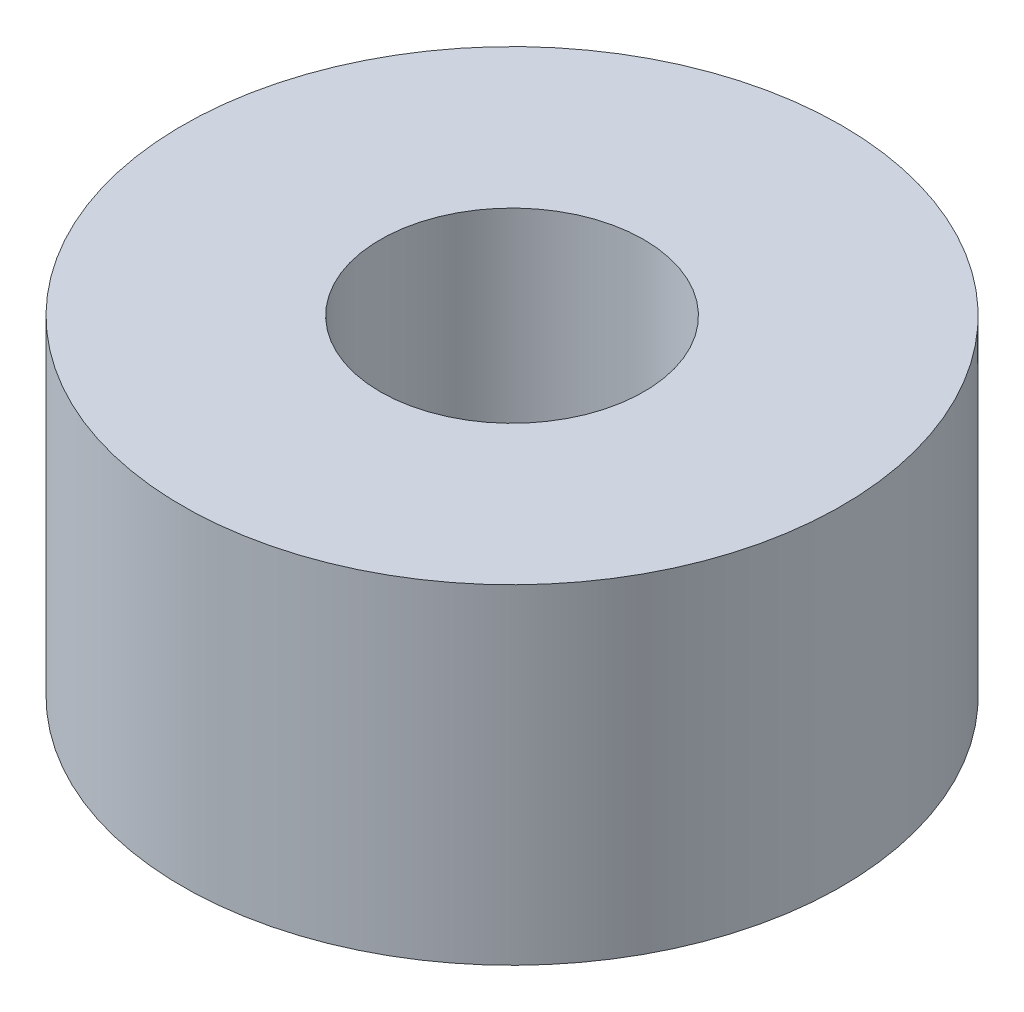
ISO-10303-21;
HEADER;
FILE_DESCRIPTION(('STEP AP214'),'2;1');
FILE_NAME('part.step','',(''),(''),'','','');
FILE_SCHEMA(('AUTOMOTIVE_DESIGN { 1 0 10303 214 1 1 1 1 }'));
ENDSEC;
DATA;
#1=APPLICATION_CONTEXT('core data for automotive mechanical design processes');
#2=APPLICATION_PROTOCOL_DEFINITION('international standard','automotive_design',2000,#1);
#3=PRODUCT_CONTEXT('',#1,'mechanical');
#4=PRODUCT('Part','Part','',(#3));
#5=PRODUCT_RELATED_PRODUCT_CATEGORY('part','',(#4));
#6=PRODUCT_DEFINITION_FORMATION('','',#4);
#7=PRODUCT_DEFINITION_CONTEXT('part definition',#1,'design');
#8=PRODUCT_DEFINITION('design','',#6,#7);
#9=PRODUCT_DEFINITION_SHAPE('','',#8);
#10=(LENGTH_UNIT() NAMED_UNIT(*) SI_UNIT(.MILLI.,.METRE.));
#11=(NAMED_UNIT(*) PLANE_ANGLE_UNIT() SI_UNIT($,.RADIAN.));
#12=(NAMED_UNIT(*) SI_UNIT($,.STERADIAN.) SOLID_ANGLE_UNIT());
#13=UNCERTAINTY_MEASURE_WITH_UNIT(LENGTH_MEASURE(1.E-05),#10,'distance_accuracy_value','');
#14=(GEOMETRIC_REPRESENTATION_CONTEXT(3) GLOBAL_UNCERTAINTY_ASSIGNED_CONTEXT((#13)) GLOBAL_UNIT_ASSIGNED_CONTEXT((#10,
#11,#12)) REPRESENTATION_CONTEXT('',''));
#15=CARTESIAN_POINT('',(0.,0.,0.));
#16=DIRECTION('',(0.,0.,1.));
#17=DIRECTION('',(1.,0.,0.));
#18=AXIS2_PLACEMENT_3D('',#15,#16,#17);
#19=CARTESIAN_POINT('',(0.,2.5,0.));
#20=DIRECTION('',(0.,-1.,0.));
#21=DIRECTION('',(0.,0.,-1.));
#22=AXIS2_PLACEMENT_3D('',#19,#20,#21);
#23=CYLINDRICAL_SURFACE('',#22,2.5);
#24=CARTESIAN_POINT('',(0.,2.5,0.));
#25=DIRECTION('',(0.,-1.,0.));
#26=DIRECTION('',(0.,0.,-1.));
#27=AXIS2_PLACEMENT_3D('',#24,#25,#26);
#28=CIRCLE('',#27,2.5);
#29=CARTESIAN_POINT('',(0.,2.5,-2.5));
#30=VERTEX_POINT('',#29);
#31=EDGE_CURVE('E10',#30,#30,#28,.T.);
#32=ORIENTED_EDGE('',*,*,#31,.T.);
#33=EDGE_LOOP('',(#32));
#34=FACE_BOUND('',#33,.T.);
#35=CARTESIAN_POINT('',(0.,0.,0.));
#36=DIRECTION('',(0.,-1.,0.));
#37=DIRECTION('',(0.,0.,-1.));
#38=AXIS2_PLACEMENT_3D('',#35,#36,#37);
#39=CIRCLE('',#38,2.5);
#40=CARTESIAN_POINT('',(0.,0.,-2.5));
#41=VERTEX_POINT('',#40);
#42=EDGE_CURVE('E47',#41,#41,#39,.T.);
#43=ORIENTED_EDGE('',*,*,#42,.F.);
#44=EDGE_LOOP('',(#43));
#45=FACE_BOUND('',#44,.T.);
#46=ADVANCED_FACE('F33',(#34,#45),#23,.T.);
#47=CARTESIAN_POINT('',(2.5,2.5,0.));
#48=DIRECTION('',(0.,1.,0.));
#49=DIRECTION('',(0.,0.,1.));
#50=AXIS2_PLACEMENT_3D('',#47,#48,#49);
#51=PLANE('',#50);
#52=CARTESIAN_POINT('',(0.,2.5,0.));
#53=DIRECTION('',(0.,-1.,0.));
#54=DIRECTION('',(0.,0.,-1.));
#55=AXIS2_PLACEMENT_3D('',#52,#53,#54);
#56=CIRCLE('',#55,1.);
#57=CARTESIAN_POINT('',(0.,2.5,-1.));
#58=VERTEX_POINT('',#57);
#59=EDGE_CURVE('E39',#58,#58,#56,.T.);
#60=ORIENTED_EDGE('',*,*,#59,.T.);
#61=EDGE_LOOP('',(#60));
#62=FACE_BOUND('',#61,.T.);
#63=ORIENTED_EDGE('',*,*,#31,.F.);
#64=EDGE_LOOP('',(#63));
#65=FACE_BOUND('',#64,.T.);
#66=ADVANCED_FACE('F57',(#62,#65),#51,.T.);
#67=CARTESIAN_POINT('',(0.,2.5,0.));
#68=DIRECTION('',(0.,-1.,0.));
#69=DIRECTION('',(0.,0.,-1.));
#70=AXIS2_PLACEMENT_3D('',#67,#68,#69);
#71=CYLINDRICAL_SURFACE('',#70,1.);
#72=CARTESIAN_POINT('',(0.,0.,0.));
#73=DIRECTION('',(0.,-1.,0.));
#74=DIRECTION('',(0.,0.,-1.));
#75=AXIS2_PLACEMENT_3D('',#72,#73,#74);
#76=CIRCLE('',#75,1.);
#77=CARTESIAN_POINT('',(0.,0.,-1.));
#78=VERTEX_POINT('',#77);
#79=EDGE_CURVE('E43',#78,#78,#76,.T.);
#80=ORIENTED_EDGE('',*,*,#79,.T.);
#81=EDGE_LOOP('',(#80));
#82=FACE_BOUND('',#81,.T.);
#83=ORIENTED_EDGE('',*,*,#59,.F.);
#84=EDGE_LOOP('',(#83));
#85=FACE_BOUND('',#84,.T.);
#86=ADVANCED_FACE('F61',(#82,#85),#71,.F.);
#87=CARTESIAN_POINT('',(1.,0.,0.));
#88=DIRECTION('',(0.,-1.,0.));
#89=DIRECTION('',(0.,0.,-1.));
#90=AXIS2_PLACEMENT_3D('',#87,#88,#89);
#91=PLANE('',#90);
#92=ORIENTED_EDGE('',*,*,#42,.T.);
#93=EDGE_LOOP('',(#92));
#94=FACE_BOUND('',#93,.T.);
#95=ORIENTED_EDGE('',*,*,#79,.F.);
#96=EDGE_LOOP('',(#95));
#97=FACE_BOUND('',#96,.T.);
#98=ADVANCED_FACE('F53',(#94,#97),#91,.T.);
#99=CLOSED_SHELL('',(#46,#66,#86,#98));
#100=MANIFOLD_SOLID_BREP('B2',#99);
#101=ADVANCED_BREP_SHAPE_REPRESENTATION('',(#18,#100),#14);
#102=SHAPE_DEFINITION_REPRESENTATION(#9,#101);
ENDSEC;
END-ISO-10303-21;
